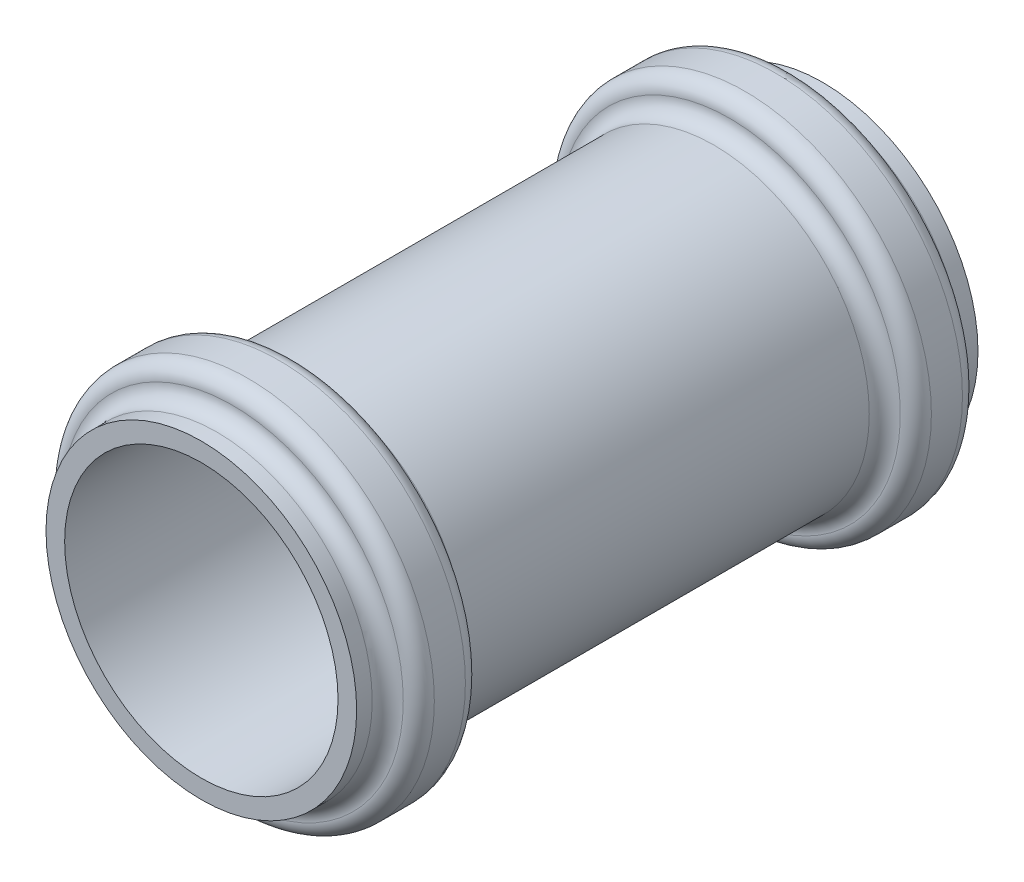
ISO-10303-21;
HEADER;
FILE_DESCRIPTION(('STEP AP214'),'2;1');
FILE_NAME('part.step','',(''),(''),'','','');
FILE_SCHEMA(('AUTOMOTIVE_DESIGN { 1 0 10303 214 1 1 1 1 }'));
ENDSEC;
DATA;
#1=APPLICATION_CONTEXT('core data for automotive mechanical design processes');
#2=APPLICATION_PROTOCOL_DEFINITION('international standard','automotive_design',2000,#1);
#3=PRODUCT_CONTEXT('',#1,'mechanical');
#4=PRODUCT('Part','Part','',(#3));
#5=PRODUCT_RELATED_PRODUCT_CATEGORY('part','',(#4));
#6=PRODUCT_DEFINITION_FORMATION('','',#4);
#7=PRODUCT_DEFINITION_CONTEXT('part definition',#1,'design');
#8=PRODUCT_DEFINITION('design','',#6,#7);
#9=PRODUCT_DEFINITION_SHAPE('','',#8);
#10=(LENGTH_UNIT() NAMED_UNIT(*) SI_UNIT(.MILLI.,.METRE.));
#11=(NAMED_UNIT(*) PLANE_ANGLE_UNIT() SI_UNIT($,.RADIAN.));
#12=(NAMED_UNIT(*) SI_UNIT($,.STERADIAN.) SOLID_ANGLE_UNIT());
#13=UNCERTAINTY_MEASURE_WITH_UNIT(LENGTH_MEASURE(1.E-05),#10,'distance_accuracy_value','');
#14=(GEOMETRIC_REPRESENTATION_CONTEXT(3) GLOBAL_UNCERTAINTY_ASSIGNED_CONTEXT((#13)) GLOBAL_UNIT_ASSIGNED_CONTEXT((#10,
#11,#12)) REPRESENTATION_CONTEXT('',''));
#15=CARTESIAN_POINT('',(0.,0.,0.));
#16=DIRECTION('',(0.,0.,1.));
#17=DIRECTION('',(1.,0.,0.));
#18=AXIS2_PLACEMENT_3D('',#15,#16,#17);
#19=CARTESIAN_POINT('',(0.,0.,100.));
#20=DIRECTION('',(0.,0.,-1.));
#21=DIRECTION('',(-1.,0.,0.));
#22=AXIS2_PLACEMENT_3D('',#19,#20,#21);
#23=CYLINDRICAL_SURFACE('',#22,25.);
#24=CARTESIAN_POINT('',(0.,0.,17.5));
#25=DIRECTION('',(0.,0.,-1.));
#26=DIRECTION('',(-1.,0.,0.));
#27=AXIS2_PLACEMENT_3D('',#24,#25,#26);
#28=CIRCLE('',#27,25.);
#29=CARTESIAN_POINT('',(-25.,0.,17.5));
#30=VERTEX_POINT('',#29);
#31=EDGE_CURVE('E42',#30,#30,#28,.F.);
#32=ORIENTED_EDGE('',*,*,#31,.T.);
#33=EDGE_LOOP('',(#32));
#34=FACE_BOUND('',#33,.T.);
#35=CARTESIAN_POINT('',(0.,0.,82.5));
#36=DIRECTION('',(0.,0.,1.));
#37=DIRECTION('',(1.,0.,0.));
#38=AXIS2_PLACEMENT_3D('',#35,#36,#37);
#39=CIRCLE('',#38,25.);
#40=CARTESIAN_POINT('',(25.,0.,82.5));
#41=VERTEX_POINT('',#40);
#42=EDGE_CURVE('E121',#41,#41,#39,.F.);
#43=ORIENTED_EDGE('',*,*,#42,.T.);
#44=EDGE_LOOP('',(#43));
#45=FACE_BOUND('',#44,.T.);
#46=ADVANCED_FACE('F34',(#34,#45),#23,.T.);
#47=CARTESIAN_POINT('',(0.,0.,2.5));
#48=DIRECTION('',(0.,0.,-1.));
#49=DIRECTION('',(-1.,0.,0.));
#50=AXIS2_PLACEMENT_3D('',#47,#48,#49);
#51=CIRCLE('',#50,25.);
#52=CARTESIAN_POINT('',(-25.,0.,2.5));
#53=VERTEX_POINT('',#52);
#54=EDGE_CURVE('E10',#53,#53,#51,.T.);
#55=ORIENTED_EDGE('',*,*,#54,.T.);
#56=EDGE_LOOP('',(#55));
#57=FACE_BOUND('',#56,.T.);
#58=CARTESIAN_POINT('',(0.,0.,0.));
#59=DIRECTION('',(0.,0.,1.));
#60=DIRECTION('',(1.,0.,0.));
#61=AXIS2_PLACEMENT_3D('',#58,#59,#60);
#62=CIRCLE('',#61,25.);
#63=CARTESIAN_POINT('',(25.,0.,0.));
#64=VERTEX_POINT('',#63);
#65=EDGE_CURVE('E107',#64,#64,#62,.T.);
#66=ORIENTED_EDGE('',*,*,#65,.T.);
#67=EDGE_LOOP('',(#66));
#68=FACE_BOUND('',#67,.T.);
#69=ADVANCED_FACE('F75',(#57,#68),#23,.T.);
#70=CARTESIAN_POINT('',(0.,0.,100.));
#71=DIRECTION('',(0.,0.,1.));
#72=DIRECTION('',(1.,0.,0.));
#73=AXIS2_PLACEMENT_3D('',#70,#71,#72);
#74=PLANE('',#73);
#75=CARTESIAN_POINT('',(0.,0.,100.));
#76=DIRECTION('',(0.,0.,1.));
#77=DIRECTION('',(1.,0.,0.));
#78=AXIS2_PLACEMENT_3D('',#75,#76,#77);
#79=CIRCLE('',#78,25.);
#80=CARTESIAN_POINT('',(25.,0.,100.));
#81=VERTEX_POINT('',#80);
#82=EDGE_CURVE('E104',#81,#81,#79,.T.);
#83=ORIENTED_EDGE('',*,*,#82,.T.);
#84=EDGE_LOOP('',(#83));
#85=FACE_BOUND('',#84,.T.);
#86=CARTESIAN_POINT('',(0.,0.,100.));
#87=DIRECTION('',(0.,0.,1.));
#88=DIRECTION('',(1.,0.,0.));
#89=AXIS2_PLACEMENT_3D('',#86,#87,#88);
#90=CIRCLE('',#89,22.);
#91=CARTESIAN_POINT('',(22.,0.,100.));
#92=VERTEX_POINT('',#91);
#93=EDGE_CURVE('E113',#92,#92,#90,.T.);
#94=ORIENTED_EDGE('',*,*,#93,.F.);
#95=EDGE_LOOP('',(#94));
#96=FACE_BOUND('',#95,.T.);
#97=ADVANCED_FACE('F82',(#85,#96),#74,.T.);
#98=CARTESIAN_POINT('',(0.,0.,0.));
#99=DIRECTION('',(0.,0.,1.));
#100=DIRECTION('',(1.,0.,0.));
#101=AXIS2_PLACEMENT_3D('',#98,#99,#100);
#102=PLANE('',#101);
#103=ORIENTED_EDGE('',*,*,#65,.F.);
#104=EDGE_LOOP('',(#103));
#105=FACE_BOUND('',#104,.T.);
#106=CARTESIAN_POINT('',(0.,0.,0.));
#107=DIRECTION('',(0.,0.,1.));
#108=DIRECTION('',(1.,0.,0.));
#109=AXIS2_PLACEMENT_3D('',#106,#107,#108);
#110=CIRCLE('',#109,22.);
#111=CARTESIAN_POINT('',(22.,0.,0.));
#112=VERTEX_POINT('',#111);
#113=EDGE_CURVE('E116',#112,#112,#110,.T.);
#114=ORIENTED_EDGE('',*,*,#113,.T.);
#115=EDGE_LOOP('',(#114));
#116=FACE_BOUND('',#115,.T.);
#117=ADVANCED_FACE('F88',(#105,#116),#102,.F.);
#118=CARTESIAN_POINT('',(0.,0.,97.5));
#119=DIRECTION('',(0.,0.,1.));
#120=DIRECTION('',(1.,0.,0.));
#121=AXIS2_PLACEMENT_3D('',#118,#119,#120);
#122=CIRCLE('',#121,25.);
#123=CARTESIAN_POINT('',(25.,0.,97.5));
#124=VERTEX_POINT('',#123);
#125=EDGE_CURVE('E101',#124,#124,#122,.T.);
#126=ORIENTED_EDGE('',*,*,#125,.T.);
#127=EDGE_LOOP('',(#126));
#128=FACE_BOUND('',#127,.T.);
#129=ORIENTED_EDGE('',*,*,#82,.F.);
#130=EDGE_LOOP('',(#129));
#131=FACE_BOUND('',#130,.T.);
#132=ADVANCED_FACE('F78',(#128,#131),#23,.T.);
#133=CARTESIAN_POINT('',(0.,0.,100.));
#134=DIRECTION('',(0.,0.,-1.));
#135=DIRECTION('',(-1.,0.,0.));
#136=AXIS2_PLACEMENT_3D('',#133,#134,#135);
#137=CYLINDRICAL_SURFACE('',#136,22.);
#138=ORIENTED_EDGE('',*,*,#93,.T.);
#139=EDGE_LOOP('',(#138));
#140=FACE_BOUND('',#139,.T.);
#141=ORIENTED_EDGE('',*,*,#113,.F.);
#142=EDGE_LOOP('',(#141));
#143=FACE_BOUND('',#142,.T.);
#144=ADVANCED_FACE('F87',(#140,#143),#137,.F.);
#145=CARTESIAN_POINT('',(0.,0.,85.));
#146=DIRECTION('',(0.,0.,1.));
#147=DIRECTION('',(1.,0.,0.));
#148=AXIS2_PLACEMENT_3D('',#145,#146,#147);
#149=CYLINDRICAL_SURFACE('',#148,30.);
#150=CARTESIAN_POINT('',(0.,0.,87.5));
#151=DIRECTION('',(0.,0.,1.));
#152=DIRECTION('',(1.,0.,0.));
#153=AXIS2_PLACEMENT_3D('',#150,#151,#152);
#154=CIRCLE('',#153,30.);
#155=CARTESIAN_POINT('',(30.,0.,87.5));
#156=VERTEX_POINT('',#155);
#157=EDGE_CURVE('E110',#156,#156,#154,.T.);
#158=ORIENTED_EDGE('',*,*,#157,.T.);
#159=EDGE_LOOP('',(#158));
#160=FACE_BOUND('',#159,.T.);
#161=CARTESIAN_POINT('',(0.,0.,92.5));
#162=DIRECTION('',(0.,0.,1.));
#163=DIRECTION('',(1.,0.,0.));
#164=AXIS2_PLACEMENT_3D('',#161,#162,#163);
#165=CIRCLE('',#164,30.);
#166=CARTESIAN_POINT('',(30.,0.,92.5));
#167=VERTEX_POINT('',#166);
#168=EDGE_CURVE('E106',#167,#167,#165,.F.);
#169=ORIENTED_EDGE('',*,*,#168,.T.);
#170=EDGE_LOOP('',(#169));
#171=FACE_BOUND('',#170,.T.);
#172=ADVANCED_FACE('F94',(#160,#171),#149,.T.);
#173=CARTESIAN_POINT('',(0.,0.,82.5));
#174=DIRECTION('',(0.,0.,1.));
#175=DIRECTION('',(1.,0.,0.));
#176=AXIS2_PLACEMENT_3D('',#173,#174,#175);
#177=TOROIDAL_SURFACE('',#176,27.5,2.5);
#178=ORIENTED_EDGE('',*,*,#42,.F.);
#179=EDGE_LOOP('',(#178));
#180=FACE_BOUND('',#179,.T.);
#181=CARTESIAN_POINT('',(0.,0.,85.));
#182=DIRECTION('',(0.,0.,1.));
#183=DIRECTION('',(1.,0.,0.));
#184=AXIS2_PLACEMENT_3D('',#181,#182,#183);
#185=CIRCLE('',#184,27.5);
#186=CARTESIAN_POINT('',(27.5,0.,85.));
#187=VERTEX_POINT('',#186);
#188=EDGE_CURVE('E56',#187,#187,#185,.T.);
#189=ORIENTED_EDGE('',*,*,#188,.F.);
#190=EDGE_LOOP('',(#189));
#191=FACE_BOUND('',#190,.T.);
#192=ADVANCED_FACE('F149',(#180,#191),#177,.F.);
#193=CARTESIAN_POINT('',(0.,0.,87.5));
#194=DIRECTION('',(0.,0.,1.));
#195=DIRECTION('',(1.,0.,0.));
#196=AXIS2_PLACEMENT_3D('',#193,#194,#195);
#197=TOROIDAL_SURFACE('',#196,27.5,2.5);
#198=ORIENTED_EDGE('',*,*,#188,.T.);
#199=EDGE_LOOP('',(#198));
#200=FACE_BOUND('',#199,.T.);
#201=ORIENTED_EDGE('',*,*,#157,.F.);
#202=EDGE_LOOP('',(#201));
#203=FACE_BOUND('',#202,.T.);
#204=ADVANCED_FACE('F194',(#200,#203),#197,.T.);
#205=CARTESIAN_POINT('',(0.,0.,97.5));
#206=DIRECTION('',(0.,0.,1.));
#207=DIRECTION('',(1.,0.,0.));
#208=AXIS2_PLACEMENT_3D('',#205,#206,#207);
#209=TOROIDAL_SURFACE('',#208,27.5,2.5);
#210=ORIENTED_EDGE('',*,*,#125,.F.);
#211=EDGE_LOOP('',(#210));
#212=FACE_BOUND('',#211,.T.);
#213=CARTESIAN_POINT('',(0.,0.,95.));
#214=DIRECTION('',(0.,0.,1.));
#215=DIRECTION('',(1.,0.,0.));
#216=AXIS2_PLACEMENT_3D('',#213,#214,#215);
#217=CIRCLE('',#216,27.5);
#218=CARTESIAN_POINT('',(27.5,0.,95.));
#219=VERTEX_POINT('',#218);
#220=EDGE_CURVE('E52',#219,#219,#217,.F.);
#221=ORIENTED_EDGE('',*,*,#220,.F.);
#222=EDGE_LOOP('',(#221));
#223=FACE_BOUND('',#222,.T.);
#224=ADVANCED_FACE('F144',(#212,#223),#209,.F.);
#225=CARTESIAN_POINT('',(0.,0.,92.5));
#226=DIRECTION('',(0.,0.,1.));
#227=DIRECTION('',(1.,0.,0.));
#228=AXIS2_PLACEMENT_3D('',#225,#226,#227);
#229=TOROIDAL_SURFACE('',#228,27.5,2.5);
#230=ORIENTED_EDGE('',*,*,#168,.F.);
#231=EDGE_LOOP('',(#230));
#232=FACE_BOUND('',#231,.T.);
#233=ORIENTED_EDGE('',*,*,#220,.T.);
#234=EDGE_LOOP('',(#233));
#235=FACE_BOUND('',#234,.T.);
#236=ADVANCED_FACE('F135',(#232,#235),#229,.T.);
#237=CARTESIAN_POINT('',(0.,0.,15.));
#238=DIRECTION('',(0.,0.,-1.));
#239=DIRECTION('',(-1.,0.,0.));
#240=AXIS2_PLACEMENT_3D('',#237,#238,#239);
#241=CYLINDRICAL_SURFACE('',#240,30.);
#242=CARTESIAN_POINT('',(0.,0.,12.5));
#243=DIRECTION('',(0.,0.,-1.));
#244=DIRECTION('',(-1.,0.,0.));
#245=AXIS2_PLACEMENT_3D('',#242,#243,#244);
#246=CIRCLE('',#245,30.);
#247=CARTESIAN_POINT('',(-30.,0.,12.5));
#248=VERTEX_POINT('',#247);
#249=EDGE_CURVE('E47',#248,#248,#246,.T.);
#250=ORIENTED_EDGE('',*,*,#249,.T.);
#251=EDGE_LOOP('',(#250));
#252=FACE_BOUND('',#251,.T.);
#253=CARTESIAN_POINT('',(0.,0.,7.5));
#254=DIRECTION('',(0.,0.,-1.));
#255=DIRECTION('',(-1.,0.,0.));
#256=AXIS2_PLACEMENT_3D('',#253,#254,#255);
#257=CIRCLE('',#256,30.);
#258=CARTESIAN_POINT('',(-30.,0.,7.5));
#259=VERTEX_POINT('',#258);
#260=EDGE_CURVE('E125',#259,#259,#257,.F.);
#261=ORIENTED_EDGE('',*,*,#260,.T.);
#262=EDGE_LOOP('',(#261));
#263=FACE_BOUND('',#262,.T.);
#264=ADVANCED_FACE('F132',(#252,#263),#241,.T.);
#265=CARTESIAN_POINT('',(0.,0.,17.5));
#266=DIRECTION('',(0.,0.,-1.));
#267=DIRECTION('',(-1.,0.,0.));
#268=AXIS2_PLACEMENT_3D('',#265,#266,#267);
#269=TOROIDAL_SURFACE('',#268,27.5,2.5);
#270=ORIENTED_EDGE('',*,*,#31,.F.);
#271=EDGE_LOOP('',(#270));
#272=FACE_BOUND('',#271,.T.);
#273=CARTESIAN_POINT('',(0.,0.,15.));
#274=DIRECTION('',(0.,0.,-1.));
#275=DIRECTION('',(-1.,0.,0.));
#276=AXIS2_PLACEMENT_3D('',#273,#274,#275);
#277=CIRCLE('',#276,27.5);
#278=CARTESIAN_POINT('',(-27.5,0.,15.));
#279=VERTEX_POINT('',#278);
#280=EDGE_CURVE('E50',#279,#279,#277,.T.);
#281=ORIENTED_EDGE('',*,*,#280,.F.);
#282=EDGE_LOOP('',(#281));
#283=FACE_BOUND('',#282,.T.);
#284=ADVANCED_FACE('F71',(#272,#283),#269,.F.);
#285=CARTESIAN_POINT('',(0.,0.,12.5));
#286=DIRECTION('',(0.,0.,-1.));
#287=DIRECTION('',(-1.,0.,0.));
#288=AXIS2_PLACEMENT_3D('',#285,#286,#287);
#289=TOROIDAL_SURFACE('',#288,27.5,2.5);
#290=ORIENTED_EDGE('',*,*,#249,.F.);
#291=EDGE_LOOP('',(#290));
#292=FACE_BOUND('',#291,.T.);
#293=ORIENTED_EDGE('',*,*,#280,.T.);
#294=EDGE_LOOP('',(#293));
#295=FACE_BOUND('',#294,.T.);
#296=ADVANCED_FACE('F65',(#292,#295),#289,.T.);
#297=CARTESIAN_POINT('',(0.,0.,2.5));
#298=DIRECTION('',(0.,0.,-1.));
#299=DIRECTION('',(-1.,0.,0.));
#300=AXIS2_PLACEMENT_3D('',#297,#298,#299);
#301=TOROIDAL_SURFACE('',#300,27.5,2.5);
#302=ORIENTED_EDGE('',*,*,#54,.F.);
#303=EDGE_LOOP('',(#302));
#304=FACE_BOUND('',#303,.T.);
#305=CARTESIAN_POINT('',(0.,0.,5.));
#306=DIRECTION('',(0.,0.,-1.));
#307=DIRECTION('',(-1.,0.,0.));
#308=AXIS2_PLACEMENT_3D('',#305,#306,#307);
#309=CIRCLE('',#308,27.5);
#310=CARTESIAN_POINT('',(-27.5,0.,5.));
#311=VERTEX_POINT('',#310);
#312=EDGE_CURVE('E38',#311,#311,#309,.F.);
#313=ORIENTED_EDGE('',*,*,#312,.F.);
#314=EDGE_LOOP('',(#313));
#315=FACE_BOUND('',#314,.T.);
#316=ADVANCED_FACE('F36',(#304,#315),#301,.F.);
#317=CARTESIAN_POINT('',(0.,0.,7.5));
#318=DIRECTION('',(0.,0.,-1.));
#319=DIRECTION('',(-1.,0.,0.));
#320=AXIS2_PLACEMENT_3D('',#317,#318,#319);
#321=TOROIDAL_SURFACE('',#320,27.5,2.5);
#322=ORIENTED_EDGE('',*,*,#312,.T.);
#323=EDGE_LOOP('',(#322));
#324=FACE_BOUND('',#323,.T.);
#325=ORIENTED_EDGE('',*,*,#260,.F.);
#326=EDGE_LOOP('',(#325));
#327=FACE_BOUND('',#326,.T.);
#328=ADVANCED_FACE('F61',(#324,#327),#321,.T.);
#329=CLOSED_SHELL('',(#46,#69,#97,#117,#132,#144,#172,#192,#204,#224,#236,#264,#284,#296,#316,#328));
#330=MANIFOLD_SOLID_BREP('B2',#329);
#331=ADVANCED_BREP_SHAPE_REPRESENTATION('',(#18,#330),#14);
#332=SHAPE_DEFINITION_REPRESENTATION(#9,#331);
ENDSEC;
END-ISO-10303-21;
